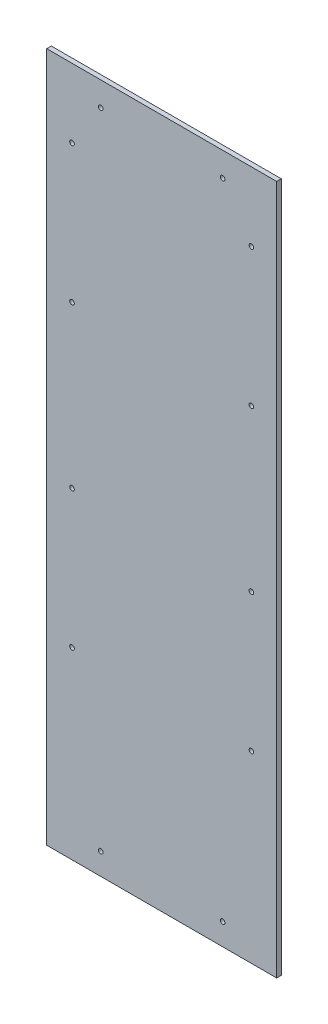
ISO-10303-21;
HEADER;
FILE_DESCRIPTION(('STEP AP214'),'2;1');
FILE_NAME('part.step','',(''),(''),'','','');
FILE_SCHEMA(('AUTOMOTIVE_DESIGN { 1 0 10303 214 1 1 1 1 }'));
ENDSEC;
DATA;
#1=APPLICATION_CONTEXT('core data for automotive mechanical design processes');
#2=APPLICATION_PROTOCOL_DEFINITION('international standard','automotive_design',2000,#1);
#3=PRODUCT_CONTEXT('',#1,'mechanical');
#4=PRODUCT('Part','Part','',(#3));
#5=PRODUCT_RELATED_PRODUCT_CATEGORY('part','',(#4));
#6=PRODUCT_DEFINITION_FORMATION('','',#4);
#7=PRODUCT_DEFINITION_CONTEXT('part definition',#1,'design');
#8=PRODUCT_DEFINITION('design','',#6,#7);
#9=PRODUCT_DEFINITION_SHAPE('','',#8);
#10=(LENGTH_UNIT() NAMED_UNIT(*) SI_UNIT(.MILLI.,.METRE.));
#11=(NAMED_UNIT(*) PLANE_ANGLE_UNIT() SI_UNIT($,.RADIAN.));
#12=(NAMED_UNIT(*) SI_UNIT($,.STERADIAN.) SOLID_ANGLE_UNIT());
#13=UNCERTAINTY_MEASURE_WITH_UNIT(LENGTH_MEASURE(1.E-05),#10,'distance_accuracy_value','');
#14=(GEOMETRIC_REPRESENTATION_CONTEXT(3) GLOBAL_UNCERTAINTY_ASSIGNED_CONTEXT((#13)) GLOBAL_UNIT_ASSIGNED_CONTEXT((#10,
#11,#12)) REPRESENTATION_CONTEXT('',''));
#15=CARTESIAN_POINT('',(0.,0.,0.));
#16=DIRECTION('',(0.,0.,1.));
#17=DIRECTION('',(1.,0.,0.));
#18=AXIS2_PLACEMENT_3D('',#15,#16,#17);
#19=CARTESIAN_POINT('',(-50.,-150.,2.));
#20=DIRECTION('',(1.,0.,0.));
#21=DIRECTION('',(0.,0.,-1.));
#22=AXIS2_PLACEMENT_3D('',#19,#20,#21);
#23=PLANE('',#22);
#24=DIRECTION('',(0.,-1.,0.));
#25=VECTOR('',#24,1.);
#26=CARTESIAN_POINT('',(-50.,-150.,0.));
#27=LINE('',#26,#25);
#28=CARTESIAN_POINT('',(-50.,150.,0.));
#29=VERTEX_POINT('',#28);
#30=CARTESIAN_POINT('',(-50.,-150.,0.));
#31=VERTEX_POINT('',#30);
#32=EDGE_CURVE('E104',#29,#31,#27,.T.);
#33=ORIENTED_EDGE('',*,*,#32,.T.);
#34=DIRECTION('',(0.,0.,-1.));
#35=VECTOR('',#34,1.);
#36=CARTESIAN_POINT('',(-50.,-150.,2.));
#37=LINE('',#36,#35);
#38=CARTESIAN_POINT('',(-50.,-150.,2.));
#39=VERTEX_POINT('',#38);
#40=EDGE_CURVE('E11',#39,#31,#37,.T.);
#41=ORIENTED_EDGE('',*,*,#40,.F.);
#42=DIRECTION('',(0.,-1.,0.));
#43=VECTOR('',#42,1.);
#44=CARTESIAN_POINT('',(-50.,-150.,2.));
#45=LINE('',#44,#43);
#46=CARTESIAN_POINT('',(-50.,150.,2.));
#47=VERTEX_POINT('',#46);
#48=EDGE_CURVE('E91',#47,#39,#45,.T.);
#49=ORIENTED_EDGE('',*,*,#48,.F.);
#50=DIRECTION('',(0.,0.,-1.));
#51=VECTOR('',#50,1.);
#52=CARTESIAN_POINT('',(-50.,150.,2.));
#53=LINE('',#52,#51);
#54=EDGE_CURVE('E100',#47,#29,#53,.T.);
#55=ORIENTED_EDGE('',*,*,#54,.T.);
#56=EDGE_LOOP('',(#33,#41,#49,#55));
#57=FACE_BOUND('',#56,.T.);
#58=ADVANCED_FACE('F38',(#57),#23,.F.);
#59=CARTESIAN_POINT('',(50.,-150.,2.));
#60=DIRECTION('',(0.,1.,0.));
#61=DIRECTION('',(0.,0.,1.));
#62=AXIS2_PLACEMENT_3D('',#59,#60,#61);
#63=PLANE('',#62);
#64=DIRECTION('',(1.,0.,0.));
#65=VECTOR('',#64,1.);
#66=CARTESIAN_POINT('',(50.,-150.,0.));
#67=LINE('',#66,#65);
#68=CARTESIAN_POINT('',(50.,-150.,0.));
#69=VERTEX_POINT('',#68);
#70=EDGE_CURVE('E95',#31,#69,#67,.T.);
#71=ORIENTED_EDGE('',*,*,#70,.T.);
#72=DIRECTION('',(0.,0.,-1.));
#73=VECTOR('',#72,1.);
#74=CARTESIAN_POINT('',(50.,-150.,2.));
#75=LINE('',#74,#73);
#76=CARTESIAN_POINT('',(50.,-150.,2.));
#77=VERTEX_POINT('',#76);
#78=EDGE_CURVE('E47',#77,#69,#75,.T.);
#79=ORIENTED_EDGE('',*,*,#78,.F.);
#80=DIRECTION('',(1.,0.,0.));
#81=VECTOR('',#80,1.);
#82=CARTESIAN_POINT('',(50.,-150.,2.));
#83=LINE('',#82,#81);
#84=EDGE_CURVE('E86',#39,#77,#83,.T.);
#85=ORIENTED_EDGE('',*,*,#84,.F.);
#86=ORIENTED_EDGE('',*,*,#40,.T.);
#87=EDGE_LOOP('',(#71,#79,#85,#86));
#88=FACE_BOUND('',#87,.T.);
#89=ADVANCED_FACE('F94',(#88),#63,.F.);
#90=CARTESIAN_POINT('',(50.,-150.,2.));
#91=DIRECTION('',(-1.,0.,0.));
#92=DIRECTION('',(0.,0.,1.));
#93=AXIS2_PLACEMENT_3D('',#90,#91,#92);
#94=PLANE('',#93);
#95=DIRECTION('',(0.,1.,0.));
#96=VECTOR('',#95,1.);
#97=CARTESIAN_POINT('',(50.,-150.,0.));
#98=LINE('',#97,#96);
#99=CARTESIAN_POINT('',(50.,150.,0.));
#100=VERTEX_POINT('',#99);
#101=EDGE_CURVE('E73',#69,#100,#98,.T.);
#102=ORIENTED_EDGE('',*,*,#101,.T.);
#103=DIRECTION('',(0.,0.,-1.));
#104=VECTOR('',#103,1.);
#105=CARTESIAN_POINT('',(50.,150.,2.));
#106=LINE('',#105,#104);
#107=CARTESIAN_POINT('',(50.,150.,2.));
#108=VERTEX_POINT('',#107);
#109=EDGE_CURVE('E96',#108,#100,#106,.T.);
#110=ORIENTED_EDGE('',*,*,#109,.F.);
#111=DIRECTION('',(0.,1.,0.));
#112=VECTOR('',#111,1.);
#113=CARTESIAN_POINT('',(50.,-150.,2.));
#114=LINE('',#113,#112);
#115=EDGE_CURVE('E89',#77,#108,#114,.T.);
#116=ORIENTED_EDGE('',*,*,#115,.F.);
#117=ORIENTED_EDGE('',*,*,#78,.T.);
#118=EDGE_LOOP('',(#102,#110,#116,#117));
#119=FACE_BOUND('',#118,.T.);
#120=ADVANCED_FACE('F98',(#119),#94,.F.);
#121=CARTESIAN_POINT('',(50.,150.,2.));
#122=DIRECTION('',(0.,-1.,0.));
#123=DIRECTION('',(1.,0.,0.));
#124=AXIS2_PLACEMENT_3D('',#121,#122,#123);
#125=PLANE('',#124);
#126=DIRECTION('',(-1.,0.,0.));
#127=VECTOR('',#126,1.);
#128=CARTESIAN_POINT('',(50.,150.,0.));
#129=LINE('',#128,#127);
#130=EDGE_CURVE('E79',#100,#29,#129,.T.);
#131=ORIENTED_EDGE('',*,*,#130,.T.);
#132=ORIENTED_EDGE('',*,*,#54,.F.);
#133=DIRECTION('',(-1.,0.,0.));
#134=VECTOR('',#133,1.);
#135=CARTESIAN_POINT('',(50.,150.,2.));
#136=LINE('',#135,#134);
#137=EDGE_CURVE('E56',#108,#47,#136,.T.);
#138=ORIENTED_EDGE('',*,*,#137,.F.);
#139=ORIENTED_EDGE('',*,*,#109,.T.);
#140=EDGE_LOOP('',(#131,#132,#138,#139));
#141=FACE_BOUND('',#140,.T.);
#142=ADVANCED_FACE('F181',(#141),#125,.F.);
#143=CARTESIAN_POINT('',(0.,0.,2.));
#144=DIRECTION('',(0.,0.,1.));
#145=DIRECTION('',(1.,0.,0.));
#146=AXIS2_PLACEMENT_3D('',#143,#144,#145);
#147=PLANE('',#146);
#148=CARTESIAN_POINT('',(-26.5,139.5,2.));
#149=DIRECTION('',(0.,0.,1.));
#150=DIRECTION('',(1.,0.,0.));
#151=AXIS2_PLACEMENT_3D('',#148,#149,#150);
#152=CIRCLE('',#151,1.);
#153=CARTESIAN_POINT('',(-25.5,139.5,2.));
#154=VERTEX_POINT('',#153);
#155=EDGE_CURVE('E340',#154,#154,#152,.T.);
#156=ORIENTED_EDGE('',*,*,#155,.F.);
#157=EDGE_LOOP('',(#156));
#158=FACE_BOUND('',#157,.T.);
#159=CARTESIAN_POINT('',(26.5,-140.5,2.));
#160=DIRECTION('',(0.,0.,1.));
#161=DIRECTION('',(1.,0.,0.));
#162=AXIS2_PLACEMENT_3D('',#159,#160,#161);
#163=CIRCLE('',#162,1.);
#164=CARTESIAN_POINT('',(27.5000000000001,-140.5,2.));
#165=VERTEX_POINT('',#164);
#166=EDGE_CURVE('E341',#165,#165,#163,.T.);
#167=ORIENTED_EDGE('',*,*,#166,.F.);
#168=EDGE_LOOP('',(#167));
#169=FACE_BOUND('',#168,.T.);
#170=CARTESIAN_POINT('',(26.5,139.5,2.));
#171=DIRECTION('',(0.,0.,1.));
#172=DIRECTION('',(1.,0.,0.));
#173=AXIS2_PLACEMENT_3D('',#170,#171,#172);
#174=CIRCLE('',#173,1.);
#175=CARTESIAN_POINT('',(27.5,139.5,2.));
#176=VERTEX_POINT('',#175);
#177=EDGE_CURVE('E346',#176,#176,#174,.T.);
#178=ORIENTED_EDGE('',*,*,#177,.F.);
#179=EDGE_LOOP('',(#178));
#180=FACE_BOUND('',#179,.T.);
#181=CARTESIAN_POINT('',(-26.5,-140.5,2.));
#182=DIRECTION('',(0.,0.,1.));
#183=DIRECTION('',(1.,0.,0.));
#184=AXIS2_PLACEMENT_3D('',#181,#182,#183);
#185=CIRCLE('',#184,1.);
#186=CARTESIAN_POINT('',(-25.5,-140.5,2.));
#187=VERTEX_POINT('',#186);
#188=EDGE_CURVE('E141',#187,#187,#185,.T.);
#189=ORIENTED_EDGE('',*,*,#188,.F.);
#190=EDGE_LOOP('',(#189));
#191=FACE_BOUND('',#190,.T.);
#192=CARTESIAN_POINT('',(-39.,-10.,2.));
#193=DIRECTION('',(0.,0.,1.));
#194=DIRECTION('',(1.,0.,0.));
#195=AXIS2_PLACEMENT_3D('',#192,#193,#194);
#196=CIRCLE('',#195,0.999999999999998);
#197=CARTESIAN_POINT('',(-38.,-10.,2.));
#198=VERTEX_POINT('',#197);
#199=EDGE_CURVE('E165',#198,#198,#196,.T.);
#200=ORIENTED_EDGE('',*,*,#199,.F.);
#201=EDGE_LOOP('',(#200));
#202=FACE_BOUND('',#201,.T.);
#203=CARTESIAN_POINT('',(39.,-10.,2.));
#204=DIRECTION('',(0.,0.,1.));
#205=DIRECTION('',(-1.,0.,0.));
#206=AXIS2_PLACEMENT_3D('',#203,#204,#205);
#207=CIRCLE('',#206,0.999999999999998);
#208=CARTESIAN_POINT('',(38.,-10.,2.));
#209=VERTEX_POINT('',#208);
#210=EDGE_CURVE('E161',#209,#209,#207,.T.);
#211=ORIENTED_EDGE('',*,*,#210,.F.);
#212=EDGE_LOOP('',(#211));
#213=FACE_BOUND('',#212,.T.);
#214=CARTESIAN_POINT('',(39.,-70.,2.));
#215=DIRECTION('',(0.,0.,1.));
#216=DIRECTION('',(-1.,0.,0.));
#217=AXIS2_PLACEMENT_3D('',#214,#215,#216);
#218=CIRCLE('',#217,0.999999999999998);
#219=CARTESIAN_POINT('',(38.,-70.,2.));
#220=VERTEX_POINT('',#219);
#221=EDGE_CURVE('E164',#220,#220,#218,.T.);
#222=ORIENTED_EDGE('',*,*,#221,.F.);
#223=EDGE_LOOP('',(#222));
#224=FACE_BOUND('',#223,.T.);
#225=CARTESIAN_POINT('',(-39.,60.,2.));
#226=DIRECTION('',(0.,0.,1.));
#227=DIRECTION('',(1.,0.,0.));
#228=AXIS2_PLACEMENT_3D('',#225,#226,#227);
#229=CIRCLE('',#228,0.999999999999998);
#230=CARTESIAN_POINT('',(-38.,60.,2.));
#231=VERTEX_POINT('',#230);
#232=EDGE_CURVE('E168',#231,#231,#229,.T.);
#233=ORIENTED_EDGE('',*,*,#232,.F.);
#234=EDGE_LOOP('',(#233));
#235=FACE_BOUND('',#234,.T.);
#236=CARTESIAN_POINT('',(-39.,-70.,2.));
#237=DIRECTION('',(0.,0.,1.));
#238=DIRECTION('',(1.,0.,0.));
#239=AXIS2_PLACEMENT_3D('',#236,#237,#238);
#240=CIRCLE('',#239,0.999999999999998);
#241=CARTESIAN_POINT('',(-38.,-70.,2.));
#242=VERTEX_POINT('',#241);
#243=EDGE_CURVE('E157',#242,#242,#240,.T.);
#244=ORIENTED_EDGE('',*,*,#243,.F.);
#245=EDGE_LOOP('',(#244));
#246=FACE_BOUND('',#245,.T.);
#247=CARTESIAN_POINT('',(39.,60.,2.));
#248=DIRECTION('',(0.,0.,1.));
#249=DIRECTION('',(-1.,0.,0.));
#250=AXIS2_PLACEMENT_3D('',#247,#248,#249);
#251=CIRCLE('',#250,0.999999999999998);
#252=CARTESIAN_POINT('',(38.,60.,2.));
#253=VERTEX_POINT('',#252);
#254=EDGE_CURVE('E152',#253,#253,#251,.T.);
#255=ORIENTED_EDGE('',*,*,#254,.F.);
#256=EDGE_LOOP('',(#255));
#257=FACE_BOUND('',#256,.T.);
#258=CARTESIAN_POINT('',(39.,120.,2.));
#259=DIRECTION('',(0.,0.,1.));
#260=DIRECTION('',(-1.,0.,0.));
#261=AXIS2_PLACEMENT_3D('',#258,#259,#260);
#262=CIRCLE('',#261,0.999999999999998);
#263=CARTESIAN_POINT('',(38.,120.,2.));
#264=VERTEX_POINT('',#263);
#265=EDGE_CURVE('E148',#264,#264,#262,.T.);
#266=ORIENTED_EDGE('',*,*,#265,.F.);
#267=EDGE_LOOP('',(#266));
#268=FACE_BOUND('',#267,.T.);
#269=CARTESIAN_POINT('',(-39.,120.,2.));
#270=DIRECTION('',(0.,0.,1.));
#271=DIRECTION('',(1.,0.,0.));
#272=AXIS2_PLACEMENT_3D('',#269,#270,#271);
#273=CIRCLE('',#272,0.999999999999998);
#274=CARTESIAN_POINT('',(-38.,120.,2.));
#275=VERTEX_POINT('',#274);
#276=EDGE_CURVE('E117',#275,#275,#273,.T.);
#277=ORIENTED_EDGE('',*,*,#276,.F.);
#278=EDGE_LOOP('',(#277));
#279=FACE_BOUND('',#278,.T.);
#280=ORIENTED_EDGE('',*,*,#48,.T.);
#281=ORIENTED_EDGE('',*,*,#84,.T.);
#282=ORIENTED_EDGE('',*,*,#115,.T.);
#283=ORIENTED_EDGE('',*,*,#137,.T.);
#284=EDGE_LOOP('',(#280,#281,#282,#283));
#285=FACE_BOUND('',#284,.T.);
#286=ADVANCED_FACE('F87',(#158,#169,#180,#191,#202,#213,#224,#235,#246,#257,#268,#279,#285),
#147,.T.);
#287=CARTESIAN_POINT('',(0.,0.,0.));
#288=DIRECTION('',(0.,0.,1.));
#289=DIRECTION('',(1.,0.,0.));
#290=AXIS2_PLACEMENT_3D('',#287,#288,#289);
#291=PLANE('',#290);
#292=CARTESIAN_POINT('',(-26.5,139.5,0.));
#293=DIRECTION('',(0.,0.,1.));
#294=DIRECTION('',(1.,0.,0.));
#295=AXIS2_PLACEMENT_3D('',#292,#293,#294);
#296=CIRCLE('',#295,1.);
#297=CARTESIAN_POINT('',(-25.5,139.5,0.));
#298=VERTEX_POINT('',#297);
#299=EDGE_CURVE('E41',#298,#298,#296,.T.);
#300=ORIENTED_EDGE('',*,*,#299,.T.);
#301=EDGE_LOOP('',(#300));
#302=FACE_BOUND('',#301,.T.);
#303=CARTESIAN_POINT('',(26.5,-140.5,0.));
#304=DIRECTION('',(0.,0.,1.));
#305=DIRECTION('',(1.,0.,0.));
#306=AXIS2_PLACEMENT_3D('',#303,#304,#305);
#307=CIRCLE('',#306,1.);
#308=CARTESIAN_POINT('',(27.5000000000001,-140.5,0.));
#309=VERTEX_POINT('',#308);
#310=EDGE_CURVE('E143',#309,#309,#307,.T.);
#311=ORIENTED_EDGE('',*,*,#310,.T.);
#312=EDGE_LOOP('',(#311));
#313=FACE_BOUND('',#312,.T.);
#314=CARTESIAN_POINT('',(26.5,139.5,0.));
#315=DIRECTION('',(0.,0.,1.));
#316=DIRECTION('',(1.,0.,0.));
#317=AXIS2_PLACEMENT_3D('',#314,#315,#316);
#318=CIRCLE('',#317,1.);
#319=CARTESIAN_POINT('',(27.5,139.5,0.));
#320=VERTEX_POINT('',#319);
#321=EDGE_CURVE('E140',#320,#320,#318,.T.);
#322=ORIENTED_EDGE('',*,*,#321,.T.);
#323=EDGE_LOOP('',(#322));
#324=FACE_BOUND('',#323,.T.);
#325=CARTESIAN_POINT('',(-26.5,-140.5,0.));
#326=DIRECTION('',(0.,0.,1.));
#327=DIRECTION('',(1.,0.,0.));
#328=AXIS2_PLACEMENT_3D('',#325,#326,#327);
#329=CIRCLE('',#328,1.);
#330=CARTESIAN_POINT('',(-25.5,-140.5,0.));
#331=VERTEX_POINT('',#330);
#332=EDGE_CURVE('E137',#331,#331,#329,.T.);
#333=ORIENTED_EDGE('',*,*,#332,.T.);
#334=EDGE_LOOP('',(#333));
#335=FACE_BOUND('',#334,.T.);
#336=CARTESIAN_POINT('',(-39.,-10.,0.));
#337=DIRECTION('',(0.,0.,1.));
#338=DIRECTION('',(1.,0.,0.));
#339=AXIS2_PLACEMENT_3D('',#336,#337,#338);
#340=CIRCLE('',#339,0.999999999999998);
#341=CARTESIAN_POINT('',(-38.,-10.,0.));
#342=VERTEX_POINT('',#341);
#343=EDGE_CURVE('E107',#342,#342,#340,.T.);
#344=ORIENTED_EDGE('',*,*,#343,.T.);
#345=EDGE_LOOP('',(#344));
#346=FACE_BOUND('',#345,.T.);
#347=CARTESIAN_POINT('',(39.,-10.,0.));
#348=DIRECTION('',(0.,0.,1.));
#349=DIRECTION('',(1.,0.,0.));
#350=AXIS2_PLACEMENT_3D('',#347,#348,#349);
#351=CIRCLE('',#350,0.999999999999998);
#352=CARTESIAN_POINT('',(40.,-10.,0.));
#353=VERTEX_POINT('',#352);
#354=EDGE_CURVE('E132',#353,#353,#351,.T.);
#355=ORIENTED_EDGE('',*,*,#354,.T.);
#356=EDGE_LOOP('',(#355));
#357=FACE_BOUND('',#356,.T.);
#358=CARTESIAN_POINT('',(39.,-70.,0.));
#359=DIRECTION('',(0.,0.,1.));
#360=DIRECTION('',(1.,0.,0.));
#361=AXIS2_PLACEMENT_3D('',#358,#359,#360);
#362=CIRCLE('',#361,0.999999999999998);
#363=CARTESIAN_POINT('',(40.,-70.,0.));
#364=VERTEX_POINT('',#363);
#365=EDGE_CURVE('E129',#364,#364,#362,.T.);
#366=ORIENTED_EDGE('',*,*,#365,.T.);
#367=EDGE_LOOP('',(#366));
#368=FACE_BOUND('',#367,.T.);
#369=CARTESIAN_POINT('',(-39.,60.,0.));
#370=DIRECTION('',(0.,0.,1.));
#371=DIRECTION('',(1.,0.,0.));
#372=AXIS2_PLACEMENT_3D('',#369,#370,#371);
#373=CIRCLE('',#372,0.999999999999998);
#374=CARTESIAN_POINT('',(-38.,60.,0.));
#375=VERTEX_POINT('',#374);
#376=EDGE_CURVE('E126',#375,#375,#373,.T.);
#377=ORIENTED_EDGE('',*,*,#376,.T.);
#378=EDGE_LOOP('',(#377));
#379=FACE_BOUND('',#378,.T.);
#380=CARTESIAN_POINT('',(-39.,-70.,0.));
#381=DIRECTION('',(0.,0.,1.));
#382=DIRECTION('',(1.,0.,0.));
#383=AXIS2_PLACEMENT_3D('',#380,#381,#382);
#384=CIRCLE('',#383,0.999999999999998);
#385=CARTESIAN_POINT('',(-38.,-70.,0.));
#386=VERTEX_POINT('',#385);
#387=EDGE_CURVE('E123',#386,#386,#384,.T.);
#388=ORIENTED_EDGE('',*,*,#387,.T.);
#389=EDGE_LOOP('',(#388));
#390=FACE_BOUND('',#389,.T.);
#391=CARTESIAN_POINT('',(39.,60.,0.));
#392=DIRECTION('',(0.,0.,1.));
#393=DIRECTION('',(1.,0.,0.));
#394=AXIS2_PLACEMENT_3D('',#391,#392,#393);
#395=CIRCLE('',#394,0.999999999999998);
#396=CARTESIAN_POINT('',(40.,60.,0.));
#397=VERTEX_POINT('',#396);
#398=EDGE_CURVE('E120',#397,#397,#395,.T.);
#399=ORIENTED_EDGE('',*,*,#398,.T.);
#400=EDGE_LOOP('',(#399));
#401=FACE_BOUND('',#400,.T.);
#402=CARTESIAN_POINT('',(39.,120.,0.));
#403=DIRECTION('',(0.,0.,1.));
#404=DIRECTION('',(1.,0.,0.));
#405=AXIS2_PLACEMENT_3D('',#402,#403,#404);
#406=CIRCLE('',#405,0.999999999999998);
#407=CARTESIAN_POINT('',(40.,120.,0.));
#408=VERTEX_POINT('',#407);
#409=EDGE_CURVE('E116',#408,#408,#406,.T.);
#410=ORIENTED_EDGE('',*,*,#409,.T.);
#411=EDGE_LOOP('',(#410));
#412=FACE_BOUND('',#411,.T.);
#413=CARTESIAN_POINT('',(-39.,120.,0.));
#414=DIRECTION('',(0.,0.,1.));
#415=DIRECTION('',(1.,0.,0.));
#416=AXIS2_PLACEMENT_3D('',#413,#414,#415);
#417=CIRCLE('',#416,0.999999999999998);
#418=CARTESIAN_POINT('',(-38.,120.,0.));
#419=VERTEX_POINT('',#418);
#420=EDGE_CURVE('E113',#419,#419,#417,.T.);
#421=ORIENTED_EDGE('',*,*,#420,.T.);
#422=EDGE_LOOP('',(#421));
#423=FACE_BOUND('',#422,.T.);
#424=ORIENTED_EDGE('',*,*,#32,.F.);
#425=ORIENTED_EDGE('',*,*,#130,.F.);
#426=ORIENTED_EDGE('',*,*,#101,.F.);
#427=ORIENTED_EDGE('',*,*,#70,.F.);
#428=EDGE_LOOP('',(#424,#425,#426,#427));
#429=FACE_BOUND('',#428,.T.);
#430=ADVANCED_FACE('F180',(#302,#313,#324,#335,#346,#357,#368,#379,#390,#401,#412,#423,#429),
#291,.F.);
#431=CARTESIAN_POINT('',(-39.,120.,-8.));
#432=DIRECTION('',(0.,0.,1.));
#433=DIRECTION('',(1.,0.,0.));
#434=AXIS2_PLACEMENT_3D('',#431,#432,#433);
#435=CYLINDRICAL_SURFACE('',#434,0.999999999999998);
#436=ORIENTED_EDGE('',*,*,#276,.T.);
#437=EDGE_LOOP('',(#436));
#438=FACE_BOUND('',#437,.T.);
#439=ORIENTED_EDGE('',*,*,#420,.F.);
#440=EDGE_LOOP('',(#439));
#441=FACE_BOUND('',#440,.T.);
#442=ADVANCED_FACE('F176',(#438,#441),#435,.F.);
#443=CARTESIAN_POINT('',(39.,120.,-8.));
#444=DIRECTION('',(0.,0.,1.));
#445=DIRECTION('',(1.,0.,0.));
#446=AXIS2_PLACEMENT_3D('',#443,#444,#445);
#447=CYLINDRICAL_SURFACE('',#446,0.999999999999998);
#448=ORIENTED_EDGE('',*,*,#265,.T.);
#449=EDGE_LOOP('',(#448));
#450=FACE_BOUND('',#449,.T.);
#451=ORIENTED_EDGE('',*,*,#409,.F.);
#452=EDGE_LOOP('',(#451));
#453=FACE_BOUND('',#452,.T.);
#454=ADVANCED_FACE('F229',(#450,#453),#447,.F.);
#455=CARTESIAN_POINT('',(39.,60.,-8.));
#456=DIRECTION('',(0.,0.,1.));
#457=DIRECTION('',(1.,0.,0.));
#458=AXIS2_PLACEMENT_3D('',#455,#456,#457);
#459=CYLINDRICAL_SURFACE('',#458,0.999999999999998);
#460=ORIENTED_EDGE('',*,*,#254,.T.);
#461=EDGE_LOOP('',(#460));
#462=FACE_BOUND('',#461,.T.);
#463=ORIENTED_EDGE('',*,*,#398,.F.);
#464=EDGE_LOOP('',(#463));
#465=FACE_BOUND('',#464,.T.);
#466=ADVANCED_FACE('F234',(#462,#465),#459,.F.);
#467=CARTESIAN_POINT('',(-39.,-70.,-8.));
#468=DIRECTION('',(0.,0.,1.));
#469=DIRECTION('',(1.,0.,0.));
#470=AXIS2_PLACEMENT_3D('',#467,#468,#469);
#471=CYLINDRICAL_SURFACE('',#470,0.999999999999998);
#472=ORIENTED_EDGE('',*,*,#243,.T.);
#473=EDGE_LOOP('',(#472));
#474=FACE_BOUND('',#473,.T.);
#475=ORIENTED_EDGE('',*,*,#387,.F.);
#476=EDGE_LOOP('',(#475));
#477=FACE_BOUND('',#476,.T.);
#478=ADVANCED_FACE('F241',(#474,#477),#471,.F.);
#479=CARTESIAN_POINT('',(-39.,60.,-8.));
#480=DIRECTION('',(0.,0.,1.));
#481=DIRECTION('',(1.,0.,0.));
#482=AXIS2_PLACEMENT_3D('',#479,#480,#481);
#483=CYLINDRICAL_SURFACE('',#482,0.999999999999998);
#484=ORIENTED_EDGE('',*,*,#232,.T.);
#485=EDGE_LOOP('',(#484));
#486=FACE_BOUND('',#485,.T.);
#487=ORIENTED_EDGE('',*,*,#376,.F.);
#488=EDGE_LOOP('',(#487));
#489=FACE_BOUND('',#488,.T.);
#490=ADVANCED_FACE('F249',(#486,#489),#483,.F.);
#491=CARTESIAN_POINT('',(39.,-70.,-8.));
#492=DIRECTION('',(0.,0.,1.));
#493=DIRECTION('',(1.,0.,0.));
#494=AXIS2_PLACEMENT_3D('',#491,#492,#493);
#495=CYLINDRICAL_SURFACE('',#494,0.999999999999998);
#496=ORIENTED_EDGE('',*,*,#221,.T.);
#497=EDGE_LOOP('',(#496));
#498=FACE_BOUND('',#497,.T.);
#499=ORIENTED_EDGE('',*,*,#365,.F.);
#500=EDGE_LOOP('',(#499));
#501=FACE_BOUND('',#500,.T.);
#502=ADVANCED_FACE('F257',(#498,#501),#495,.F.);
#503=CARTESIAN_POINT('',(39.,-10.,-8.));
#504=DIRECTION('',(0.,0.,1.));
#505=DIRECTION('',(1.,0.,0.));
#506=AXIS2_PLACEMENT_3D('',#503,#504,#505);
#507=CYLINDRICAL_SURFACE('',#506,0.999999999999998);
#508=ORIENTED_EDGE('',*,*,#210,.T.);
#509=EDGE_LOOP('',(#508));
#510=FACE_BOUND('',#509,.T.);
#511=ORIENTED_EDGE('',*,*,#354,.F.);
#512=EDGE_LOOP('',(#511));
#513=FACE_BOUND('',#512,.T.);
#514=ADVANCED_FACE('F265',(#510,#513),#507,.F.);
#515=CARTESIAN_POINT('',(-39.,-10.,-8.));
#516=DIRECTION('',(0.,0.,1.));
#517=DIRECTION('',(1.,0.,0.));
#518=AXIS2_PLACEMENT_3D('',#515,#516,#517);
#519=CYLINDRICAL_SURFACE('',#518,0.999999999999998);
#520=ORIENTED_EDGE('',*,*,#199,.T.);
#521=EDGE_LOOP('',(#520));
#522=FACE_BOUND('',#521,.T.);
#523=ORIENTED_EDGE('',*,*,#343,.F.);
#524=EDGE_LOOP('',(#523));
#525=FACE_BOUND('',#524,.T.);
#526=ADVANCED_FACE('F273',(#522,#525),#519,.F.);
#527=CARTESIAN_POINT('',(-26.5,-140.5,-8.));
#528=DIRECTION('',(0.,0.,1.));
#529=DIRECTION('',(1.,0.,0.));
#530=AXIS2_PLACEMENT_3D('',#527,#528,#529);
#531=CYLINDRICAL_SURFACE('',#530,1.);
#532=ORIENTED_EDGE('',*,*,#188,.T.);
#533=EDGE_LOOP('',(#532));
#534=FACE_BOUND('',#533,.T.);
#535=ORIENTED_EDGE('',*,*,#332,.F.);
#536=EDGE_LOOP('',(#535));
#537=FACE_BOUND('',#536,.T.);
#538=ADVANCED_FACE('F280',(#534,#537),#531,.F.);
#539=CARTESIAN_POINT('',(26.5,139.5,-8.));
#540=DIRECTION('',(0.,0.,1.));
#541=DIRECTION('',(1.,0.,0.));
#542=AXIS2_PLACEMENT_3D('',#539,#540,#541);
#543=CYLINDRICAL_SURFACE('',#542,1.);
#544=ORIENTED_EDGE('',*,*,#177,.T.);
#545=EDGE_LOOP('',(#544));
#546=FACE_BOUND('',#545,.T.);
#547=ORIENTED_EDGE('',*,*,#321,.F.);
#548=EDGE_LOOP('',(#547));
#549=FACE_BOUND('',#548,.T.);
#550=ADVANCED_FACE('F287',(#546,#549),#543,.F.);
#551=CARTESIAN_POINT('',(26.5,-140.5,-8.));
#552=DIRECTION('',(0.,0.,1.));
#553=DIRECTION('',(1.,0.,0.));
#554=AXIS2_PLACEMENT_3D('',#551,#552,#553);
#555=CYLINDRICAL_SURFACE('',#554,1.);
#556=ORIENTED_EDGE('',*,*,#166,.T.);
#557=EDGE_LOOP('',(#556));
#558=FACE_BOUND('',#557,.T.);
#559=ORIENTED_EDGE('',*,*,#310,.F.);
#560=EDGE_LOOP('',(#559));
#561=FACE_BOUND('',#560,.T.);
#562=ADVANCED_FACE('F295',(#558,#561),#555,.F.);
#563=CARTESIAN_POINT('',(-26.5,139.5,-8.));
#564=DIRECTION('',(0.,0.,1.));
#565=DIRECTION('',(1.,0.,0.));
#566=AXIS2_PLACEMENT_3D('',#563,#564,#565);
#567=CYLINDRICAL_SURFACE('',#566,1.);
#568=ORIENTED_EDGE('',*,*,#155,.T.);
#569=EDGE_LOOP('',(#568));
#570=FACE_BOUND('',#569,.T.);
#571=ORIENTED_EDGE('',*,*,#299,.F.);
#572=EDGE_LOOP('',(#571));
#573=FACE_BOUND('',#572,.T.);
#574=ADVANCED_FACE('F303',(#570,#573),#567,.F.);
#575=CLOSED_SHELL('',(#58,#89,#120,#142,#286,#430,#442,#454,#466,#478,#490,#502,#514,#526,#538,
#550,#562,#574));
#576=MANIFOLD_SOLID_BREP('B2',#575);
#577=ADVANCED_BREP_SHAPE_REPRESENTATION('',(#18,#576),#14);
#578=SHAPE_DEFINITION_REPRESENTATION(#9,#577);
ENDSEC;
END-ISO-10303-21;
